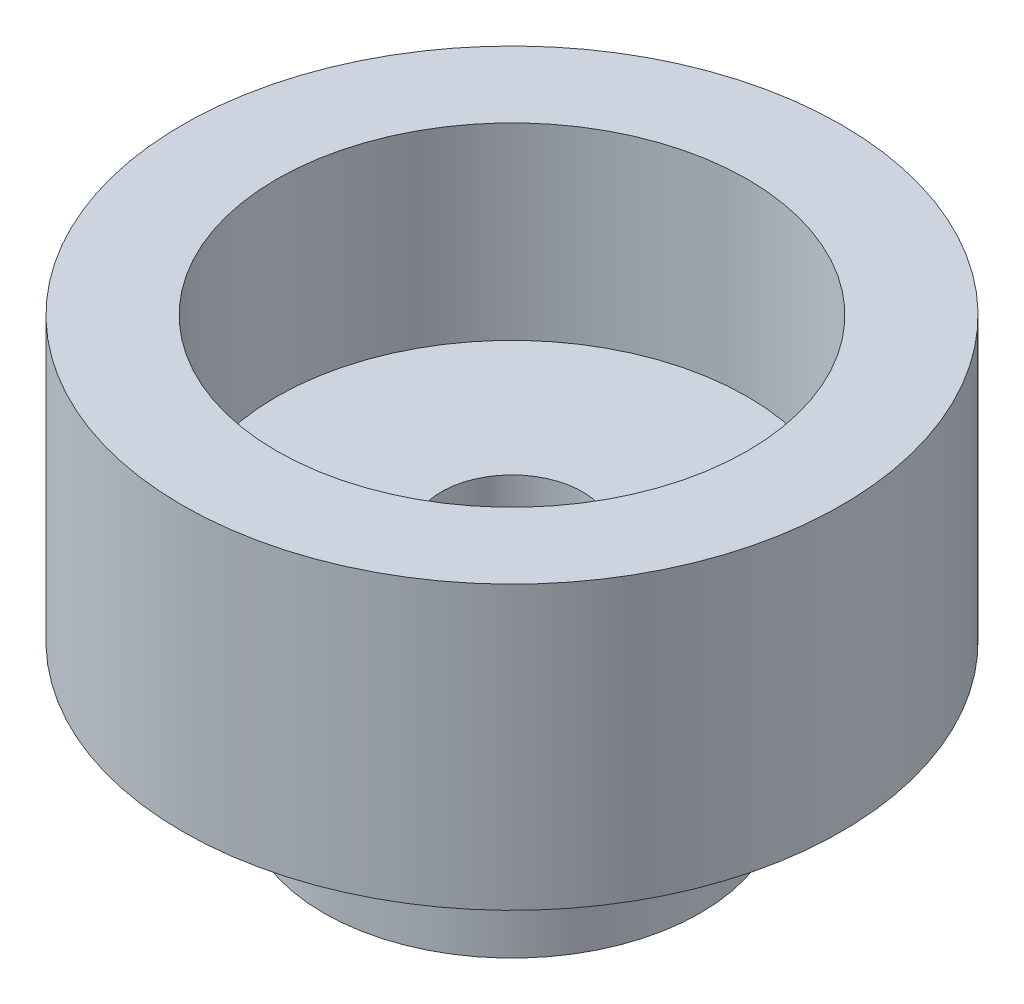
ISO-10303-21;
HEADER;
FILE_DESCRIPTION(('STEP AP214'),'2;1');
FILE_NAME('part.step','',(''),(''),'','','');
FILE_SCHEMA(('AUTOMOTIVE_DESIGN { 1 0 10303 214 1 1 1 1 }'));
ENDSEC;
DATA;
#1=APPLICATION_CONTEXT('core data for automotive mechanical design processes');
#2=APPLICATION_PROTOCOL_DEFINITION('international standard','automotive_design',2000,#1);
#3=PRODUCT_CONTEXT('',#1,'mechanical');
#4=PRODUCT('Part','Part','',(#3));
#5=PRODUCT_RELATED_PRODUCT_CATEGORY('part','',(#4));
#6=PRODUCT_DEFINITION_FORMATION('','',#4);
#7=PRODUCT_DEFINITION_CONTEXT('part definition',#1,'design');
#8=PRODUCT_DEFINITION('design','',#6,#7);
#9=PRODUCT_DEFINITION_SHAPE('','',#8);
#10=(LENGTH_UNIT() NAMED_UNIT(*) SI_UNIT(.MILLI.,.METRE.));
#11=(NAMED_UNIT(*) PLANE_ANGLE_UNIT() SI_UNIT($,.RADIAN.));
#12=(NAMED_UNIT(*) SI_UNIT($,.STERADIAN.) SOLID_ANGLE_UNIT());
#13=UNCERTAINTY_MEASURE_WITH_UNIT(LENGTH_MEASURE(1.E-05),#10,'distance_accuracy_value','');
#14=(GEOMETRIC_REPRESENTATION_CONTEXT(3) GLOBAL_UNCERTAINTY_ASSIGNED_CONTEXT((#13)) GLOBAL_UNIT_ASSIGNED_CONTEXT((#10,
#11,#12)) REPRESENTATION_CONTEXT('',''));
#15=CARTESIAN_POINT('',(0.,0.,0.));
#16=DIRECTION('',(0.,0.,1.));
#17=DIRECTION('',(1.,0.,0.));
#18=AXIS2_PLACEMENT_3D('',#15,#16,#17);
#19=CARTESIAN_POINT('',(0.,2.5,0.));
#20=DIRECTION('',(0.,1.,0.));
#21=DIRECTION('',(0.,0.,1.));
#22=AXIS2_PLACEMENT_3D('',#19,#20,#21);
#23=PLANE('',#22);
#24=CARTESIAN_POINT('',(0.,2.5,0.));
#25=DIRECTION('',(0.,1.,0.));
#26=DIRECTION('',(0.,0.,1.));
#27=AXIS2_PLACEMENT_3D('',#24,#25,#26);
#28=CIRCLE('',#27,0.75);
#29=CARTESIAN_POINT('',(0.,2.5,0.75));
#30=VERTEX_POINT('',#29);
#31=EDGE_CURVE('E50',#30,#30,#28,.T.);
#32=ORIENTED_EDGE('',*,*,#31,.F.);
#33=EDGE_LOOP('',(#32));
#34=FACE_BOUND('',#33,.T.);
#35=CARTESIAN_POINT('',(0.,2.5,0.));
#36=DIRECTION('',(0.,1.,0.));
#37=DIRECTION('',(0.,0.,1.));
#38=AXIS2_PLACEMENT_3D('',#35,#36,#37);
#39=CIRCLE('',#38,2.5);
#40=CARTESIAN_POINT('',(0.,2.5,2.5));
#41=VERTEX_POINT('',#40);
#42=EDGE_CURVE('E45',#41,#41,#39,.F.);
#43=ORIENTED_EDGE('',*,*,#42,.F.);
#44=EDGE_LOOP('',(#43));
#45=FACE_BOUND('',#44,.T.);
#46=ADVANCED_FACE('F37',(#34,#45),#23,.T.);
#47=CARTESIAN_POINT('',(0.,0.,0.));
#48=DIRECTION('',(0.,1.,0.));
#49=DIRECTION('',(0.,0.,1.));
#50=AXIS2_PLACEMENT_3D('',#47,#48,#49);
#51=PLANE('',#50);
#52=CARTESIAN_POINT('',(0.,0.,0.));
#53=DIRECTION('',(0.,1.,0.));
#54=DIRECTION('',(0.,0.,1.));
#55=AXIS2_PLACEMENT_3D('',#52,#53,#54);
#56=CIRCLE('',#55,0.75);
#57=CARTESIAN_POINT('',(0.,0.,0.75));
#58=VERTEX_POINT('',#57);
#59=EDGE_CURVE('E55',#58,#58,#56,.T.);
#60=ORIENTED_EDGE('',*,*,#59,.T.);
#61=EDGE_LOOP('',(#60));
#62=FACE_BOUND('',#61,.T.);
#63=CARTESIAN_POINT('',(0.,0.,0.));
#64=DIRECTION('',(0.,-1.,0.));
#65=DIRECTION('',(0.,0.,-1.));
#66=AXIS2_PLACEMENT_3D('',#63,#64,#65);
#67=CIRCLE('',#66,2.);
#68=CARTESIAN_POINT('',(0.,0.,-2.));
#69=VERTEX_POINT('',#68);
#70=EDGE_CURVE('E73',#69,#69,#67,.T.);
#71=ORIENTED_EDGE('',*,*,#70,.T.);
#72=EDGE_LOOP('',(#71));
#73=FACE_BOUND('',#72,.T.);
#74=ADVANCED_FACE('F39',(#62,#73),#51,.F.);
#75=CARTESIAN_POINT('',(0.,2.5,0.));
#76=DIRECTION('',(0.,-1.,0.));
#77=DIRECTION('',(0.,0.,-1.));
#78=AXIS2_PLACEMENT_3D('',#75,#76,#77);
#79=CYLINDRICAL_SURFACE('',#78,0.75);
#80=ORIENTED_EDGE('',*,*,#59,.F.);
#81=EDGE_LOOP('',(#80));
#82=FACE_BOUND('',#81,.T.);
#83=ORIENTED_EDGE('',*,*,#31,.T.);
#84=EDGE_LOOP('',(#83));
#85=FACE_BOUND('',#84,.T.);
#86=ADVANCED_FACE('F94',(#82,#85),#79,.F.);
#87=CARTESIAN_POINT('',(0.,1.5,0.));
#88=DIRECTION('',(0.,-1.,0.));
#89=DIRECTION('',(0.,0.,-1.));
#90=AXIS2_PLACEMENT_3D('',#87,#88,#89);
#91=PLANE('',#90);
#92=CARTESIAN_POINT('',(0.,1.5,0.));
#93=DIRECTION('',(0.,-1.,0.));
#94=DIRECTION('',(0.,0.,-1.));
#95=AXIS2_PLACEMENT_3D('',#92,#93,#94);
#96=CIRCLE('',#95,2.);
#97=CARTESIAN_POINT('',(0.,1.5,-2.));
#98=VERTEX_POINT('',#97);
#99=EDGE_CURVE('E10',#98,#98,#96,.T.);
#100=ORIENTED_EDGE('',*,*,#99,.F.);
#101=EDGE_LOOP('',(#100));
#102=FACE_BOUND('',#101,.T.);
#103=CARTESIAN_POINT('',(0.,1.5,0.));
#104=DIRECTION('',(0.,-1.,0.));
#105=DIRECTION('',(0.,0.,-1.));
#106=AXIS2_PLACEMENT_3D('',#103,#104,#105);
#107=CIRCLE('',#106,3.5);
#108=CARTESIAN_POINT('',(0.,1.5,-3.5));
#109=VERTEX_POINT('',#108);
#110=EDGE_CURVE('E60',#109,#109,#107,.T.);
#111=ORIENTED_EDGE('',*,*,#110,.T.);
#112=EDGE_LOOP('',(#111));
#113=FACE_BOUND('',#112,.T.);
#114=ADVANCED_FACE('F101',(#102,#113),#91,.T.);
#115=CARTESIAN_POINT('',(0.,1.5,0.));
#116=DIRECTION('',(0.,1.,0.));
#117=DIRECTION('',(0.,0.,1.));
#118=AXIS2_PLACEMENT_3D('',#115,#116,#117);
#119=CYLINDRICAL_SURFACE('',#118,3.5);
#120=ORIENTED_EDGE('',*,*,#110,.F.);
#121=EDGE_LOOP('',(#120));
#122=FACE_BOUND('',#121,.T.);
#123=CARTESIAN_POINT('',(0.,4.5,0.));
#124=DIRECTION('',(0.,1.,0.));
#125=DIRECTION('',(0.,0.,1.));
#126=AXIS2_PLACEMENT_3D('',#123,#124,#125);
#127=CIRCLE('',#126,3.5);
#128=CARTESIAN_POINT('',(0.,4.5,3.5));
#129=VERTEX_POINT('',#128);
#130=EDGE_CURVE('E65',#129,#129,#127,.T.);
#131=ORIENTED_EDGE('',*,*,#130,.F.);
#132=EDGE_LOOP('',(#131));
#133=FACE_BOUND('',#132,.T.);
#134=ADVANCED_FACE('F103',(#122,#133),#119,.T.);
#135=CARTESIAN_POINT('',(0.,4.5,0.));
#136=DIRECTION('',(0.,1.,0.));
#137=DIRECTION('',(0.,0.,1.));
#138=AXIS2_PLACEMENT_3D('',#135,#136,#137);
#139=PLANE('',#138);
#140=ORIENTED_EDGE('',*,*,#130,.T.);
#141=EDGE_LOOP('',(#140));
#142=FACE_BOUND('',#141,.T.);
#143=CARTESIAN_POINT('',(0.,4.5,0.));
#144=DIRECTION('',(0.,1.,0.));
#145=DIRECTION('',(0.,0.,1.));
#146=AXIS2_PLACEMENT_3D('',#143,#144,#145);
#147=CIRCLE('',#146,2.5);
#148=CARTESIAN_POINT('',(0.,4.5,2.5));
#149=VERTEX_POINT('',#148);
#150=EDGE_CURVE('E69',#149,#149,#147,.T.);
#151=ORIENTED_EDGE('',*,*,#150,.F.);
#152=EDGE_LOOP('',(#151));
#153=FACE_BOUND('',#152,.T.);
#154=ADVANCED_FACE('F86',(#142,#153),#139,.T.);
#155=CARTESIAN_POINT('',(0.,4.5,0.));
#156=DIRECTION('',(0.,-1.,0.));
#157=DIRECTION('',(0.,0.,-1.));
#158=AXIS2_PLACEMENT_3D('',#155,#156,#157);
#159=CYLINDRICAL_SURFACE('',#158,2.5);
#160=ORIENTED_EDGE('',*,*,#150,.T.);
#161=EDGE_LOOP('',(#160));
#162=FACE_BOUND('',#161,.T.);
#163=ORIENTED_EDGE('',*,*,#42,.T.);
#164=EDGE_LOOP('',(#163));
#165=FACE_BOUND('',#164,.T.);
#166=ADVANCED_FACE('F81',(#162,#165),#159,.F.);
#167=CARTESIAN_POINT('',(0.,2.,0.));
#168=DIRECTION('',(0.,-1.,0.));
#169=DIRECTION('',(0.,0.,-1.));
#170=AXIS2_PLACEMENT_3D('',#167,#168,#169);
#171=CYLINDRICAL_SURFACE('',#170,2.);
#172=ORIENTED_EDGE('',*,*,#99,.T.);
#173=EDGE_LOOP('',(#172));
#174=FACE_BOUND('',#173,.T.);
#175=ORIENTED_EDGE('',*,*,#70,.F.);
#176=EDGE_LOOP('',(#175));
#177=FACE_BOUND('',#176,.T.);
#178=ADVANCED_FACE('F79',(#174,#177),#171,.T.);
#179=CLOSED_SHELL('',(#46,#74,#86,#114,#134,#154,#166,#178));
#180=MANIFOLD_SOLID_BREP('B2',#179);
#181=ADVANCED_BREP_SHAPE_REPRESENTATION('',(#18,#180),#14);
#182=SHAPE_DEFINITION_REPRESENTATION(#9,#181);
ENDSEC;
END-ISO-10303-21;
